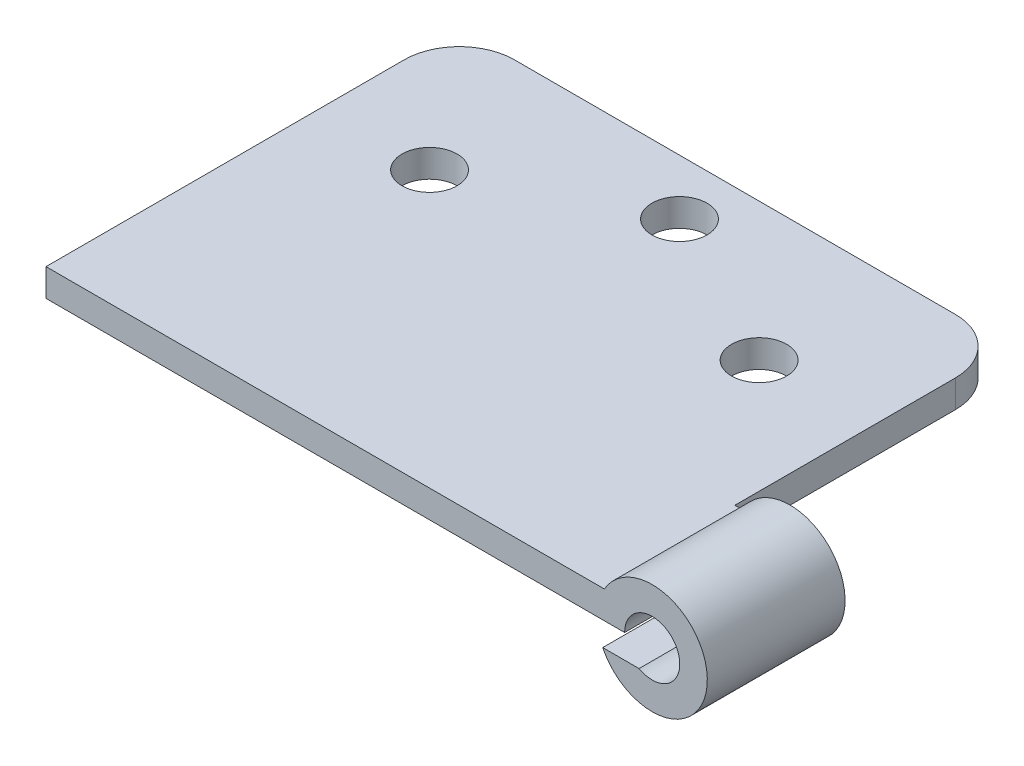
ISO-10303-21;
HEADER;
FILE_DESCRIPTION(('STEP AP214'),'2;1');
FILE_NAME('part.step','',(''),(''),'','','');
FILE_SCHEMA(('AUTOMOTIVE_DESIGN { 1 0 10303 214 1 1 1 1 }'));
ENDSEC;
DATA;
#1=APPLICATION_CONTEXT('core data for automotive mechanical design processes');
#2=APPLICATION_PROTOCOL_DEFINITION('international standard','automotive_design',2000,#1);
#3=PRODUCT_CONTEXT('',#1,'mechanical');
#4=PRODUCT('Part','Part','',(#3));
#5=PRODUCT_RELATED_PRODUCT_CATEGORY('part','',(#4));
#6=PRODUCT_DEFINITION_FORMATION('','',#4);
#7=PRODUCT_DEFINITION_CONTEXT('part definition',#1,'design');
#8=PRODUCT_DEFINITION('design','',#6,#7);
#9=PRODUCT_DEFINITION_SHAPE('','',#8);
#10=(LENGTH_UNIT() NAMED_UNIT(*) SI_UNIT(.MILLI.,.METRE.));
#11=(NAMED_UNIT(*) PLANE_ANGLE_UNIT() SI_UNIT($,.RADIAN.));
#12=(NAMED_UNIT(*) SI_UNIT($,.STERADIAN.) SOLID_ANGLE_UNIT());
#13=UNCERTAINTY_MEASURE_WITH_UNIT(LENGTH_MEASURE(1.E-05),#10,'distance_accuracy_value','');
#14=(GEOMETRIC_REPRESENTATION_CONTEXT(3) GLOBAL_UNCERTAINTY_ASSIGNED_CONTEXT((#13)) GLOBAL_UNIT_ASSIGNED_CONTEXT((#10,
#11,#12)) REPRESENTATION_CONTEXT('',''));
#15=CARTESIAN_POINT('',(0.,0.,0.));
#16=DIRECTION('',(0.,0.,1.));
#17=DIRECTION('',(1.,0.,0.));
#18=AXIS2_PLACEMENT_3D('',#15,#16,#17);
#19=CARTESIAN_POINT('',(-80.,10.,-30.));
#20=DIRECTION('',(0.,1.,0.));
#21=DIRECTION('',(0.,0.,1.));
#22=AXIS2_PLACEMENT_3D('',#19,#20,#21);
#23=PLANE('',#22);
#24=CARTESIAN_POINT('',(58.7939698492463,10.,0.));
#25=DIRECTION('',(0.,1.,0.));
#26=DIRECTION('',(0.,0.,1.));
#27=AXIS2_PLACEMENT_3D('',#24,#25,#26);
#28=CIRCLE('',#27,10.);
#29=CARTESIAN_POINT('',(58.7939698492463,10.,10.));
#30=VERTEX_POINT('',#29);
#31=EDGE_CURVE('E243',#30,#30,#28,.T.);
#32=ORIENTED_EDGE('',*,*,#31,.F.);
#33=EDGE_LOOP('',(#32));
#34=FACE_BOUND('',#33,.T.);
#35=CARTESIAN_POINT('',(-80.,10.,-30.));
#36=DIRECTION('',(0.,1.,0.));
#37=DIRECTION('',(0.,0.,1.));
#38=AXIS2_PLACEMENT_3D('',#35,#36,#37);
#39=CIRCLE('',#38,20.);
#40=CARTESIAN_POINT('',(-79.9999999999998,10.,-50.));
#41=VERTEX_POINT('',#40);
#42=CARTESIAN_POINT('',(-100.,10.,-29.9999999999999));
#43=VERTEX_POINT('',#42);
#44=EDGE_CURVE('E143',#41,#43,#39,.T.);
#45=ORIENTED_EDGE('',*,*,#44,.T.);
#46=DIRECTION('',(0.,0.,-1.));
#47=VECTOR('',#46,1.);
#48=CARTESIAN_POINT('',(-100.,10.,50.));
#49=LINE('',#48,#47);
#50=CARTESIAN_POINT('',(-100.,10.,100.));
#51=VERTEX_POINT('',#50);
#52=EDGE_CURVE('E255',#51,#43,#49,.T.);
#53=ORIENTED_EDGE('',*,*,#52,.F.);
#54=DIRECTION('',(1.,0.,0.));
#55=VECTOR('',#54,1.);
#56=CARTESIAN_POINT('',(100.,10.,100.));
#57=LINE('',#56,#55);
#58=CARTESIAN_POINT('',(102.633258284826,10.,100.));
#59=VERTEX_POINT('',#58);
#60=EDGE_CURVE('E204',#51,#59,#57,.T.);
#61=ORIENTED_EDGE('',*,*,#60,.T.);
#62=DIRECTION('',(0.,0.,-1.));
#63=VECTOR('',#62,1.);
#64=CARTESIAN_POINT('',(102.633258284826,10.,100.));
#65=LINE('',#64,#63);
#66=CARTESIAN_POINT('',(102.633258284826,10.,50.));
#67=VERTEX_POINT('',#66);
#68=EDGE_CURVE('E218',#59,#67,#65,.T.);
#69=ORIENTED_EDGE('',*,*,#68,.T.);
#70=DIRECTION('',(-1.,0.,0.));
#71=VECTOR('',#70,1.);
#72=CARTESIAN_POINT('',(100.,10.,50.));
#73=LINE('',#72,#71);
#74=CARTESIAN_POINT('',(100.,10.,50.));
#75=VERTEX_POINT('',#74);
#76=EDGE_CURVE('E205',#67,#75,#73,.T.);
#77=ORIENTED_EDGE('',*,*,#76,.T.);
#78=DIRECTION('',(0.,0.,-1.));
#79=VECTOR('',#78,1.);
#80=CARTESIAN_POINT('',(100.,10.,50.));
#81=LINE('',#80,#79);
#82=CARTESIAN_POINT('',(100.,10.,-29.9999999999999));
#83=VERTEX_POINT('',#82);
#84=EDGE_CURVE('E258',#75,#83,#81,.T.);
#85=ORIENTED_EDGE('',*,*,#84,.T.);
#86=CARTESIAN_POINT('',(80.,10.,-30.));
#87=DIRECTION('',(0.,-1.,0.));
#88=DIRECTION('',(0.,0.,-1.));
#89=AXIS2_PLACEMENT_3D('',#86,#87,#88);
#90=CIRCLE('',#89,20.);
#91=CARTESIAN_POINT('',(79.9999999999999,10.,-50.));
#92=VERTEX_POINT('',#91);
#93=EDGE_CURVE('E260',#92,#83,#90,.T.);
#94=ORIENTED_EDGE('',*,*,#93,.F.);
#95=DIRECTION('',(1.,0.,0.));
#96=VECTOR('',#95,1.);
#97=CARTESIAN_POINT('',(-79.9999999999998,10.,-50.));
#98=LINE('',#97,#96);
#99=EDGE_CURVE('E263',#41,#92,#98,.T.);
#100=ORIENTED_EDGE('',*,*,#99,.F.);
#101=EDGE_LOOP('',(#45,#53,#61,#69,#77,#85,#94,#100));
#102=FACE_BOUND('',#101,.T.);
#103=CARTESIAN_POINT('',(-60.8040201005025,10.,0.));
#104=DIRECTION('',(0.,1.,0.));
#105=DIRECTION('',(0.,0.,1.));
#106=AXIS2_PLACEMENT_3D('',#103,#104,#105);
#107=CIRCLE('',#106,10.);
#108=CARTESIAN_POINT('',(-60.8040201005025,10.,10.));
#109=VERTEX_POINT('',#108);
#110=EDGE_CURVE('E249',#109,#109,#107,.T.);
#111=ORIENTED_EDGE('',*,*,#110,.F.);
#112=EDGE_LOOP('',(#111));
#113=FACE_BOUND('',#112,.T.);
#114=CARTESIAN_POINT('',(0.,10.,-29.8994974874372));
#115=DIRECTION('',(0.,1.,0.));
#116=DIRECTION('',(0.,0.,1.));
#117=AXIS2_PLACEMENT_3D('',#114,#115,#116);
#118=CIRCLE('',#117,10.);
#119=CARTESIAN_POINT('',(0.,10.,-19.8994974874372));
#120=VERTEX_POINT('',#119);
#121=EDGE_CURVE('E237',#120,#120,#118,.T.);
#122=ORIENTED_EDGE('',*,*,#121,.F.);
#123=EDGE_LOOP('',(#122));
#124=FACE_BOUND('',#123,.T.);
#125=ADVANCED_FACE('F98',(#34,#102,#113,#124),#23,.T.);
#126=CARTESIAN_POINT('',(-80.,0.,-30.));
#127=DIRECTION('',(0.,1.,0.));
#128=DIRECTION('',(0.,0.,1.));
#129=AXIS2_PLACEMENT_3D('',#126,#127,#128);
#130=PLANE('',#129);
#131=CARTESIAN_POINT('',(-80.,0.,-30.));
#132=DIRECTION('',(0.,1.,0.));
#133=DIRECTION('',(0.,0.,1.));
#134=AXIS2_PLACEMENT_3D('',#131,#132,#133);
#135=CIRCLE('',#134,20.);
#136=CARTESIAN_POINT('',(-79.9999999999998,0.,-50.));
#137=VERTEX_POINT('',#136);
#138=CARTESIAN_POINT('',(-100.,0.,-29.9999999999999));
#139=VERTEX_POINT('',#138);
#140=EDGE_CURVE('E188',#137,#139,#135,.T.);
#141=ORIENTED_EDGE('',*,*,#140,.F.);
#142=DIRECTION('',(1.,0.,0.));
#143=VECTOR('',#142,1.);
#144=CARTESIAN_POINT('',(-79.9999999999998,0.,-50.));
#145=LINE('',#144,#143);
#146=CARTESIAN_POINT('',(79.9999999999999,0.,-50.));
#147=VERTEX_POINT('',#146);
#148=EDGE_CURVE('E256',#137,#147,#145,.T.);
#149=ORIENTED_EDGE('',*,*,#148,.T.);
#150=CARTESIAN_POINT('',(80.,0.,-30.));
#151=DIRECTION('',(0.,-1.,0.));
#152=DIRECTION('',(0.,0.,-1.));
#153=AXIS2_PLACEMENT_3D('',#150,#151,#152);
#154=CIRCLE('',#153,20.);
#155=CARTESIAN_POINT('',(100.,0.,-29.9999999999999));
#156=VERTEX_POINT('',#155);
#157=EDGE_CURVE('E268',#147,#156,#154,.T.);
#158=ORIENTED_EDGE('',*,*,#157,.T.);
#159=DIRECTION('',(0.,0.,-1.));
#160=VECTOR('',#159,1.);
#161=CARTESIAN_POINT('',(100.,0.,50.));
#162=LINE('',#161,#160);
#163=CARTESIAN_POINT('',(100.,0.,50.));
#164=VERTEX_POINT('',#163);
#165=EDGE_CURVE('E187',#164,#156,#162,.T.);
#166=ORIENTED_EDGE('',*,*,#165,.F.);
#167=DIRECTION('',(1.,0.,0.));
#168=VECTOR('',#167,1.);
#169=CARTESIAN_POINT('',(100.,0.,50.));
#170=LINE('',#169,#168);
#171=CARTESIAN_POINT('',(110.000160918887,0.,50.));
#172=VERTEX_POINT('',#171);
#173=EDGE_CURVE('E219',#164,#172,#170,.T.);
#174=ORIENTED_EDGE('',*,*,#173,.T.);
#175=DIRECTION('',(0.,0.,-1.));
#176=VECTOR('',#175,1.);
#177=CARTESIAN_POINT('',(110.000160918887,0.,100.));
#178=LINE('',#177,#176);
#179=CARTESIAN_POINT('',(110.000160918887,0.,100.));
#180=VERTEX_POINT('',#179);
#181=EDGE_CURVE('E195',#180,#172,#178,.T.);
#182=ORIENTED_EDGE('',*,*,#181,.F.);
#183=DIRECTION('',(1.,0.,0.));
#184=VECTOR('',#183,1.);
#185=CARTESIAN_POINT('',(-100.,0.,100.));
#186=LINE('',#185,#184);
#187=CARTESIAN_POINT('',(-100.,0.,100.));
#188=VERTEX_POINT('',#187);
#189=EDGE_CURVE('E191',#188,#180,#186,.T.);
#190=ORIENTED_EDGE('',*,*,#189,.F.);
#191=DIRECTION('',(0.,0.,-1.));
#192=VECTOR('',#191,1.);
#193=CARTESIAN_POINT('',(-100.,0.,50.));
#194=LINE('',#193,#192);
#195=EDGE_CURVE('E180',#188,#139,#194,.T.);
#196=ORIENTED_EDGE('',*,*,#195,.T.);
#197=EDGE_LOOP('',(#141,#149,#158,#166,#174,#182,#190,#196));
#198=FACE_BOUND('',#197,.T.);
#199=CARTESIAN_POINT('',(-60.8040201005025,0.,0.));
#200=DIRECTION('',(0.,1.,0.));
#201=DIRECTION('',(0.,0.,1.));
#202=AXIS2_PLACEMENT_3D('',#199,#200,#201);
#203=CIRCLE('',#202,10.);
#204=CARTESIAN_POINT('',(-60.8040201005025,0.,10.));
#205=VERTEX_POINT('',#204);
#206=EDGE_CURVE('E246',#205,#205,#203,.T.);
#207=ORIENTED_EDGE('',*,*,#206,.T.);
#208=EDGE_LOOP('',(#207));
#209=FACE_BOUND('',#208,.T.);
#210=CARTESIAN_POINT('',(58.7939698492463,0.,0.));
#211=DIRECTION('',(0.,1.,0.));
#212=DIRECTION('',(0.,0.,1.));
#213=AXIS2_PLACEMENT_3D('',#210,#211,#212);
#214=CIRCLE('',#213,10.);
#215=CARTESIAN_POINT('',(58.7939698492463,0.,10.));
#216=VERTEX_POINT('',#215);
#217=EDGE_CURVE('E240',#216,#216,#214,.T.);
#218=ORIENTED_EDGE('',*,*,#217,.T.);
#219=EDGE_LOOP('',(#218));
#220=FACE_BOUND('',#219,.T.);
#221=CARTESIAN_POINT('',(0.,0.,-29.8994974874372));
#222=DIRECTION('',(0.,1.,0.));
#223=DIRECTION('',(0.,0.,1.));
#224=AXIS2_PLACEMENT_3D('',#221,#222,#223);
#225=CIRCLE('',#224,10.);
#226=CARTESIAN_POINT('',(0.,0.,-19.8994974874372));
#227=VERTEX_POINT('',#226);
#228=EDGE_CURVE('E236',#227,#227,#225,.T.);
#229=ORIENTED_EDGE('',*,*,#228,.T.);
#230=EDGE_LOOP('',(#229));
#231=FACE_BOUND('',#230,.T.);
#232=ADVANCED_FACE('F192',(#198,#209,#220,#231),#130,.F.);
#233=CARTESIAN_POINT('',(-80.,10.,-30.));
#234=DIRECTION('',(0.,-1.,0.));
#235=DIRECTION('',(0.,0.,-1.));
#236=AXIS2_PLACEMENT_3D('',#233,#234,#235);
#237=CYLINDRICAL_SURFACE('',#236,20.);
#238=ORIENTED_EDGE('',*,*,#140,.T.);
#239=DIRECTION('',(0.,-1.,0.));
#240=VECTOR('',#239,1.);
#241=CARTESIAN_POINT('',(-100.,10.,-29.9999999999999));
#242=LINE('',#241,#240);
#243=EDGE_CURVE('E12',#43,#139,#242,.T.);
#244=ORIENTED_EDGE('',*,*,#243,.F.);
#245=ORIENTED_EDGE('',*,*,#44,.F.);
#246=DIRECTION('',(0.,-1.,0.));
#247=VECTOR('',#246,1.);
#248=CARTESIAN_POINT('',(-79.9999999999998,10.,-50.));
#249=LINE('',#248,#247);
#250=EDGE_CURVE('E115',#41,#137,#249,.T.);
#251=ORIENTED_EDGE('',*,*,#250,.T.);
#252=EDGE_LOOP('',(#238,#244,#245,#251));
#253=FACE_BOUND('',#252,.T.);
#254=ADVANCED_FACE('F100',(#253),#237,.T.);
#255=CARTESIAN_POINT('',(-100.,10.,50.));
#256=DIRECTION('',(-1.,0.,0.));
#257=DIRECTION('',(0.,0.,1.));
#258=AXIS2_PLACEMENT_3D('',#255,#256,#257);
#259=PLANE('',#258);
#260=ORIENTED_EDGE('',*,*,#195,.F.);
#261=DIRECTION('',(0.,-1.,0.));
#262=VECTOR('',#261,1.);
#263=CARTESIAN_POINT('',(-100.,10.,100.));
#264=LINE('',#263,#262);
#265=EDGE_CURVE('E185',#51,#188,#264,.T.);
#266=ORIENTED_EDGE('',*,*,#265,.F.);
#267=ORIENTED_EDGE('',*,*,#52,.T.);
#268=ORIENTED_EDGE('',*,*,#243,.T.);
#269=EDGE_LOOP('',(#260,#266,#267,#268));
#270=FACE_BOUND('',#269,.T.);
#271=ADVANCED_FACE('F182',(#270),#259,.T.);
#272=CARTESIAN_POINT('',(100.,10.,50.));
#273=DIRECTION('',(-1.,0.,0.));
#274=DIRECTION('',(0.,0.,1.));
#275=AXIS2_PLACEMENT_3D('',#272,#273,#274);
#276=PLANE('',#275);
#277=ORIENTED_EDGE('',*,*,#165,.T.);
#278=DIRECTION('',(0.,-1.,0.));
#279=VECTOR('',#278,1.);
#280=CARTESIAN_POINT('',(100.,10.,-29.9999999999999));
#281=LINE('',#280,#279);
#282=EDGE_CURVE('E275',#83,#156,#281,.T.);
#283=ORIENTED_EDGE('',*,*,#282,.F.);
#284=ORIENTED_EDGE('',*,*,#84,.F.);
#285=DIRECTION('',(0.,-1.,0.));
#286=VECTOR('',#285,1.);
#287=CARTESIAN_POINT('',(100.,10.,50.));
#288=LINE('',#287,#286);
#289=EDGE_CURVE('E107',#75,#164,#288,.T.);
#290=ORIENTED_EDGE('',*,*,#289,.T.);
#291=EDGE_LOOP('',(#277,#283,#284,#290));
#292=FACE_BOUND('',#291,.T.);
#293=ADVANCED_FACE('F280',(#292),#276,.F.);
#294=CARTESIAN_POINT('',(80.,10.,-30.));
#295=DIRECTION('',(0.,-1.,0.));
#296=DIRECTION('',(0.,0.,-1.));
#297=AXIS2_PLACEMENT_3D('',#294,#295,#296);
#298=CYLINDRICAL_SURFACE('',#297,20.);
#299=ORIENTED_EDGE('',*,*,#157,.F.);
#300=DIRECTION('',(0.,-1.,0.));
#301=VECTOR('',#300,1.);
#302=CARTESIAN_POINT('',(79.9999999999999,10.,-50.));
#303=LINE('',#302,#301);
#304=EDGE_CURVE('E132',#92,#147,#303,.T.);
#305=ORIENTED_EDGE('',*,*,#304,.F.);
#306=ORIENTED_EDGE('',*,*,#93,.T.);
#307=ORIENTED_EDGE('',*,*,#282,.T.);
#308=EDGE_LOOP('',(#299,#305,#306,#307));
#309=FACE_BOUND('',#308,.T.);
#310=ADVANCED_FACE('F284',(#309),#298,.T.);
#311=CARTESIAN_POINT('',(-79.9999999999998,10.,-50.));
#312=DIRECTION('',(0.,0.,-1.));
#313=DIRECTION('',(-1.,0.,0.));
#314=AXIS2_PLACEMENT_3D('',#311,#312,#313);
#315=PLANE('',#314);
#316=ORIENTED_EDGE('',*,*,#148,.F.);
#317=ORIENTED_EDGE('',*,*,#250,.F.);
#318=ORIENTED_EDGE('',*,*,#99,.T.);
#319=ORIENTED_EDGE('',*,*,#304,.T.);
#320=EDGE_LOOP('',(#316,#317,#318,#319));
#321=FACE_BOUND('',#320,.T.);
#322=ADVANCED_FACE('F287',(#321),#315,.T.);
#323=CARTESIAN_POINT('',(-60.8040201005025,10.,0.));
#324=DIRECTION('',(0.,-1.,0.));
#325=DIRECTION('',(0.,0.,-1.));
#326=AXIS2_PLACEMENT_3D('',#323,#324,#325);
#327=CYLINDRICAL_SURFACE('',#326,10.);
#328=ORIENTED_EDGE('',*,*,#110,.T.);
#329=EDGE_LOOP('',(#328));
#330=FACE_BOUND('',#329,.T.);
#331=ORIENTED_EDGE('',*,*,#206,.F.);
#332=EDGE_LOOP('',(#331));
#333=FACE_BOUND('',#332,.T.);
#334=ADVANCED_FACE('F289',(#330,#333),#327,.F.);
#335=CARTESIAN_POINT('',(58.7939698492463,10.,0.));
#336=DIRECTION('',(0.,-1.,0.));
#337=DIRECTION('',(0.,0.,-1.));
#338=AXIS2_PLACEMENT_3D('',#335,#336,#337);
#339=CYLINDRICAL_SURFACE('',#338,10.);
#340=ORIENTED_EDGE('',*,*,#31,.T.);
#341=EDGE_LOOP('',(#340));
#342=FACE_BOUND('',#341,.T.);
#343=ORIENTED_EDGE('',*,*,#217,.F.);
#344=EDGE_LOOP('',(#343));
#345=FACE_BOUND('',#344,.T.);
#346=ADVANCED_FACE('F295',(#342,#345),#339,.F.);
#347=CARTESIAN_POINT('',(0.,10.,-29.8994974874372));
#348=DIRECTION('',(0.,-1.,0.));
#349=DIRECTION('',(0.,0.,-1.));
#350=AXIS2_PLACEMENT_3D('',#347,#348,#349);
#351=CYLINDRICAL_SURFACE('',#350,10.);
#352=ORIENTED_EDGE('',*,*,#121,.T.);
#353=EDGE_LOOP('',(#352));
#354=FACE_BOUND('',#353,.T.);
#355=ORIENTED_EDGE('',*,*,#228,.F.);
#356=EDGE_LOOP('',(#355));
#357=FACE_BOUND('',#356,.T.);
#358=ADVANCED_FACE('F310',(#354,#357),#351,.F.);
#359=CARTESIAN_POINT('',(119.999839084997,0.0802282631548268,100.));
#360=DIRECTION('',(0.,0.,-1.));
#361=DIRECTION('',(-1.,0.,0.));
#362=AXIS2_PLACEMENT_3D('',#359,#360,#361);
#363=CYLINDRICAL_SURFACE('',#362,10.);
#364=CARTESIAN_POINT('',(119.999839084997,0.0802282631548268,50.));
#365=DIRECTION('',(0.,0.,1.));
#366=DIRECTION('',(1.,0.,0.));
#367=AXIS2_PLACEMENT_3D('',#364,#365,#366);
#368=CIRCLE('',#367,10.);
#369=CARTESIAN_POINT('',(115.232280048414,-8.71012900106892,50.));
#370=VERTEX_POINT('',#369);
#371=EDGE_CURVE('E221',#370,#172,#368,.T.);
#372=ORIENTED_EDGE('',*,*,#371,.F.);
#373=DIRECTION('',(0.,0.,-1.));
#374=VECTOR('',#373,1.);
#375=CARTESIAN_POINT('',(115.232280048414,-8.71012900106892,100.));
#376=LINE('',#375,#374);
#377=CARTESIAN_POINT('',(115.232280048414,-8.71012900106892,100.));
#378=VERTEX_POINT('',#377);
#379=EDGE_CURVE('E233',#378,#370,#376,.T.);
#380=ORIENTED_EDGE('',*,*,#379,.F.);
#381=CARTESIAN_POINT('',(119.999839084997,0.0802282631548268,100.));
#382=DIRECTION('',(0.,0.,1.));
#383=DIRECTION('',(1.,0.,0.));
#384=AXIS2_PLACEMENT_3D('',#381,#382,#383);
#385=CIRCLE('',#384,10.);
#386=EDGE_CURVE('E199',#378,#180,#385,.T.);
#387=ORIENTED_EDGE('',*,*,#386,.T.);
#388=ORIENTED_EDGE('',*,*,#181,.T.);
#389=EDGE_LOOP('',(#372,#380,#387,#388));
#390=FACE_BOUND('',#389,.T.);
#391=ADVANCED_FACE('F314',(#390),#363,.F.);
#392=CARTESIAN_POINT('',(102.035162100222,-8.71012900106892,100.));
#393=DIRECTION('',(0.,1.,0.));
#394=DIRECTION('',(0.,0.,1.));
#395=AXIS2_PLACEMENT_3D('',#392,#393,#394);
#396=PLANE('',#395);
#397=DIRECTION('',(1.,0.,0.));
#398=VECTOR('',#397,1.);
#399=CARTESIAN_POINT('',(102.035162100222,-8.71012900106892,50.));
#400=LINE('',#399,#398);
#401=CARTESIAN_POINT('',(102.035162100222,-8.71012900106892,50.));
#402=VERTEX_POINT('',#401);
#403=EDGE_CURVE('E224',#402,#370,#400,.T.);
#404=ORIENTED_EDGE('',*,*,#403,.F.);
#405=DIRECTION('',(0.,0.,-1.));
#406=VECTOR('',#405,1.);
#407=CARTESIAN_POINT('',(102.035162100222,-8.71012900106892,100.));
#408=LINE('',#407,#406);
#409=CARTESIAN_POINT('',(102.035162100222,-8.71012900106892,100.));
#410=VERTEX_POINT('',#409);
#411=EDGE_CURVE('E231',#410,#402,#408,.T.);
#412=ORIENTED_EDGE('',*,*,#411,.F.);
#413=DIRECTION('',(1.,0.,0.));
#414=VECTOR('',#413,1.);
#415=CARTESIAN_POINT('',(102.035162100222,-8.71012900106892,100.));
#416=LINE('',#415,#414);
#417=EDGE_CURVE('E212',#410,#378,#416,.T.);
#418=ORIENTED_EDGE('',*,*,#417,.T.);
#419=ORIENTED_EDGE('',*,*,#379,.T.);
#420=EDGE_LOOP('',(#404,#412,#418,#419));
#421=FACE_BOUND('',#420,.T.);
#422=ADVANCED_FACE('F318',(#421),#396,.T.);
#423=CARTESIAN_POINT('',(119.999839084997,0.0802282631548268,100.));
#424=DIRECTION('',(0.,0.,-1.));
#425=DIRECTION('',(-1.,0.,0.));
#426=AXIS2_PLACEMENT_3D('',#423,#424,#425);
#427=CYLINDRICAL_SURFACE('',#426,20.);
#428=CARTESIAN_POINT('',(119.999839084997,0.0802282631548268,50.));
#429=DIRECTION('',(0.,0.,1.));
#430=DIRECTION('',(1.,0.,0.));
#431=AXIS2_PLACEMENT_3D('',#428,#429,#430);
#432=CIRCLE('',#431,20.);
#433=EDGE_CURVE('E208',#402,#67,#432,.T.);
#434=ORIENTED_EDGE('',*,*,#433,.T.);
#435=ORIENTED_EDGE('',*,*,#68,.F.);
#436=CARTESIAN_POINT('',(119.999839084997,0.0802282631548268,100.));
#437=DIRECTION('',(0.,0.,1.));
#438=DIRECTION('',(1.,0.,0.));
#439=AXIS2_PLACEMENT_3D('',#436,#437,#438);
#440=CIRCLE('',#439,20.);
#441=EDGE_CURVE('E215',#410,#59,#440,.T.);
#442=ORIENTED_EDGE('',*,*,#441,.F.);
#443=ORIENTED_EDGE('',*,*,#411,.T.);
#444=EDGE_LOOP('',(#434,#435,#442,#443));
#445=FACE_BOUND('',#444,.T.);
#446=ADVANCED_FACE('F322',(#445),#427,.T.);
#447=CARTESIAN_POINT('',(119.999839084997,0.0802282631548268,100.));
#448=DIRECTION('',(0.,0.,1.));
#449=DIRECTION('',(1.,0.,0.));
#450=AXIS2_PLACEMENT_3D('',#447,#448,#449);
#451=PLANE('',#450);
#452=ORIENTED_EDGE('',*,*,#265,.T.);
#453=ORIENTED_EDGE('',*,*,#189,.T.);
#454=ORIENTED_EDGE('',*,*,#386,.F.);
#455=ORIENTED_EDGE('',*,*,#417,.F.);
#456=ORIENTED_EDGE('',*,*,#441,.T.);
#457=ORIENTED_EDGE('',*,*,#60,.F.);
#458=EDGE_LOOP('',(#452,#453,#454,#455,#456,#457));
#459=FACE_BOUND('',#458,.T.);
#460=ADVANCED_FACE('F202',(#459),#451,.T.);
#461=CARTESIAN_POINT('',(119.999839084997,0.0802282631548268,50.));
#462=DIRECTION('',(0.,0.,1.));
#463=DIRECTION('',(1.,0.,0.));
#464=AXIS2_PLACEMENT_3D('',#461,#462,#463);
#465=PLANE('',#464);
#466=ORIENTED_EDGE('',*,*,#289,.F.);
#467=ORIENTED_EDGE('',*,*,#76,.F.);
#468=ORIENTED_EDGE('',*,*,#433,.F.);
#469=ORIENTED_EDGE('',*,*,#403,.T.);
#470=ORIENTED_EDGE('',*,*,#371,.T.);
#471=ORIENTED_EDGE('',*,*,#173,.F.);
#472=EDGE_LOOP('',(#466,#467,#468,#469,#470,#471));
#473=FACE_BOUND('',#472,.T.);
#474=ADVANCED_FACE('F327',(#473),#465,.F.);
#475=CLOSED_SHELL('',(#125,#232,#254,#271,#293,#310,#322,#334,#346,#358,#391,#422,#446,#460,#474));
#476=MANIFOLD_SOLID_BREP('B2',#475);
#477=ADVANCED_BREP_SHAPE_REPRESENTATION('',(#18,#476),#14);
#478=SHAPE_DEFINITION_REPRESENTATION(#9,#477);
ENDSEC;
END-ISO-10303-21;
